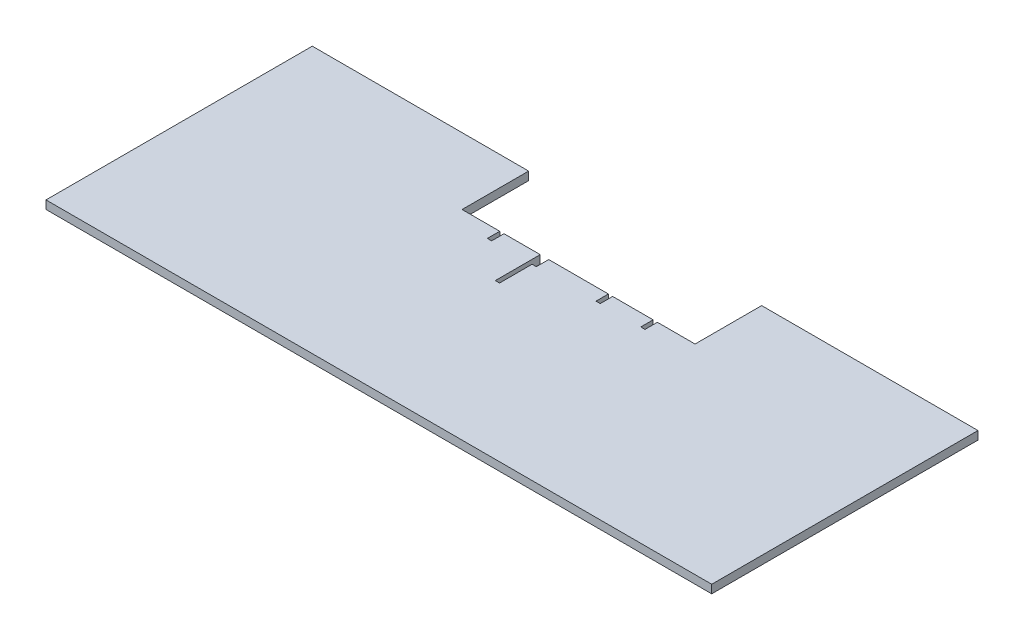
ISO-10303-21;
HEADER;
FILE_DESCRIPTION(('STEP AP214'),'2;1');
FILE_NAME('part.step','',(''),(''),'','','');
FILE_SCHEMA(('AUTOMOTIVE_DESIGN { 1 0 10303 214 1 1 1 1 }'));
ENDSEC;
DATA;
#1=APPLICATION_CONTEXT('core data for automotive mechanical design processes');
#2=APPLICATION_PROTOCOL_DEFINITION('international standard','automotive_design',2000,#1);
#3=PRODUCT_CONTEXT('',#1,'mechanical');
#4=PRODUCT('Part','Part','',(#3));
#5=PRODUCT_RELATED_PRODUCT_CATEGORY('part','',(#4));
#6=PRODUCT_DEFINITION_FORMATION('','',#4);
#7=PRODUCT_DEFINITION_CONTEXT('part definition',#1,'design');
#8=PRODUCT_DEFINITION('design','',#6,#7);
#9=PRODUCT_DEFINITION_SHAPE('','',#8);
#10=(LENGTH_UNIT() NAMED_UNIT(*) SI_UNIT(.MILLI.,.METRE.));
#11=(NAMED_UNIT(*) PLANE_ANGLE_UNIT() SI_UNIT($,.RADIAN.));
#12=(NAMED_UNIT(*) SI_UNIT($,.STERADIAN.) SOLID_ANGLE_UNIT());
#13=UNCERTAINTY_MEASURE_WITH_UNIT(LENGTH_MEASURE(1.E-05),#10,'distance_accuracy_value','');
#14=(GEOMETRIC_REPRESENTATION_CONTEXT(3) GLOBAL_UNCERTAINTY_ASSIGNED_CONTEXT((#13)) GLOBAL_UNIT_ASSIGNED_CONTEXT((#10,
#11,#12)) REPRESENTATION_CONTEXT('',''));
#15=CARTESIAN_POINT('',(0.,0.,0.));
#16=DIRECTION('',(0.,0.,1.));
#17=DIRECTION('',(1.,0.,0.));
#18=AXIS2_PLACEMENT_3D('',#15,#16,#17);
#19=CARTESIAN_POINT('',(82.55,3.175,-76.2));
#20=DIRECTION('',(0.,0.,1.));
#21=DIRECTION('',(1.,0.,0.));
#22=AXIS2_PLACEMENT_3D('',#19,#20,#21);
#23=PLANE('',#22);
#24=DIRECTION('',(-1.,0.,0.));
#25=VECTOR('',#24,1.);
#26=CARTESIAN_POINT('',(82.55,0.,-76.2));
#27=LINE('',#26,#25);
#28=CARTESIAN_POINT('',(171.45,0.,-76.2));
#29=VERTEX_POINT('',#28);
#30=CARTESIAN_POINT('',(157.070331057297,0.,-76.2));
#31=VERTEX_POINT('',#30);
#32=EDGE_CURVE('E221',#29,#31,#27,.T.);
#33=ORIENTED_EDGE('',*,*,#32,.T.);
#34=DIRECTION('',(0.,1.,0.));
#35=VECTOR('',#34,1.);
#36=CARTESIAN_POINT('',(157.070331057297,-0.00100000000000013,-76.2));
#37=LINE('',#36,#35);
#38=CARTESIAN_POINT('',(157.070331057297,3.175,-76.2));
#39=VERTEX_POINT('',#38);
#40=EDGE_CURVE('E202',#31,#39,#37,.T.);
#41=ORIENTED_EDGE('',*,*,#40,.T.);
#42=DIRECTION('',(-1.,0.,0.));
#43=VECTOR('',#42,1.);
#44=CARTESIAN_POINT('',(82.55,3.175,-76.2));
#45=LINE('',#44,#43);
#46=CARTESIAN_POINT('',(171.45,3.175,-76.2));
#47=VERTEX_POINT('',#46);
#48=EDGE_CURVE('E262',#47,#39,#45,.T.);
#49=ORIENTED_EDGE('',*,*,#48,.F.);
#50=DIRECTION('',(0.,-1.,0.));
#51=VECTOR('',#50,1.);
#52=CARTESIAN_POINT('',(171.45,3.175,-76.2));
#53=LINE('',#52,#51);
#54=EDGE_CURVE('E228',#47,#29,#53,.T.);
#55=ORIENTED_EDGE('',*,*,#54,.T.);
#56=EDGE_LOOP('',(#33,#41,#49,#55));
#57=FACE_BOUND('',#56,.T.);
#58=ADVANCED_FACE('F30',(#57),#23,.F.);
#59=CARTESIAN_POINT('',(155.444731057297,3.175,-76.2000000000002));
#60=VERTEX_POINT('',#59);
#61=CARTESIAN_POINT('',(140.003991611403,3.175,-76.2000000000001));
#62=VERTEX_POINT('',#61);
#63=EDGE_CURVE('E264',#60,#62,#45,.T.);
#64=ORIENTED_EDGE('',*,*,#63,.F.);
#65=DIRECTION('',(0.,1.,0.));
#66=VECTOR('',#65,1.);
#67=CARTESIAN_POINT('',(155.444731057297,-0.00100000000000013,-76.2000000000002));
#68=LINE('',#67,#66);
#69=CARTESIAN_POINT('',(155.444731057297,0.,-76.2));
#70=VERTEX_POINT('',#69);
#71=EDGE_CURVE('E372',#70,#60,#68,.T.);
#72=ORIENTED_EDGE('',*,*,#71,.F.);
#73=CARTESIAN_POINT('',(140.003991611403,0.,-76.2));
#74=VERTEX_POINT('',#73);
#75=EDGE_CURVE('E230',#70,#74,#27,.T.);
#76=ORIENTED_EDGE('',*,*,#75,.T.);
#77=DIRECTION('',(0.,1.,0.));
#78=VECTOR('',#77,1.);
#79=CARTESIAN_POINT('',(140.003991611403,-0.00100000000000013,-76.2000000000001));
#80=LINE('',#79,#78);
#81=EDGE_CURVE('E349',#74,#62,#80,.T.);
#82=ORIENTED_EDGE('',*,*,#81,.T.);
#83=EDGE_LOOP('',(#64,#72,#76,#82));
#84=FACE_BOUND('',#83,.T.);
#85=ADVANCED_FACE('F392',(#84),#23,.F.);
#86=CARTESIAN_POINT('',(138.378391611403,3.175,-76.2000000000001));
#87=VERTEX_POINT('',#86);
#88=CARTESIAN_POINT('',(115.621608388597,3.175,-76.2));
#89=VERTEX_POINT('',#88);
#90=EDGE_CURVE('E395',#87,#89,#45,.T.);
#91=ORIENTED_EDGE('',*,*,#90,.F.);
#92=DIRECTION('',(0.,1.,0.));
#93=VECTOR('',#92,1.);
#94=CARTESIAN_POINT('',(138.378391611403,-0.00100000000000013,-76.2000000000001));
#95=LINE('',#94,#93);
#96=CARTESIAN_POINT('',(138.378391611403,0.,-76.2));
#97=VERTEX_POINT('',#96);
#98=EDGE_CURVE('E350',#97,#87,#95,.T.);
#99=ORIENTED_EDGE('',*,*,#98,.F.);
#100=CARTESIAN_POINT('',(115.621608388597,0.,-76.2));
#101=VERTEX_POINT('',#100);
#102=EDGE_CURVE('E235',#97,#101,#27,.T.);
#103=ORIENTED_EDGE('',*,*,#102,.T.);
#104=DIRECTION('',(0.,1.,0.));
#105=VECTOR('',#104,1.);
#106=CARTESIAN_POINT('',(115.621608388597,-0.00100000000000013,-76.2));
#107=LINE('',#106,#105);
#108=EDGE_CURVE('E306',#101,#89,#107,.T.);
#109=ORIENTED_EDGE('',*,*,#108,.T.);
#110=EDGE_LOOP('',(#91,#99,#103,#109));
#111=FACE_BOUND('',#110,.T.);
#112=ADVANCED_FACE('F485',(#111),#23,.F.);
#113=CARTESIAN_POINT('',(96.9296689427032,3.175,-76.2));
#114=VERTEX_POINT('',#113);
#115=CARTESIAN_POINT('',(82.55,3.175,-76.2));
#116=VERTEX_POINT('',#115);
#117=EDGE_CURVE('E265',#114,#116,#45,.T.);
#118=ORIENTED_EDGE('',*,*,#117,.F.);
#119=DIRECTION('',(0.,1.,0.));
#120=VECTOR('',#119,1.);
#121=CARTESIAN_POINT('',(96.9296689427032,-0.00100000000000013,-76.2));
#122=LINE('',#121,#120);
#123=CARTESIAN_POINT('',(96.9296689427032,0.,-76.2));
#124=VERTEX_POINT('',#123);
#125=EDGE_CURVE('E279',#124,#114,#122,.T.);
#126=ORIENTED_EDGE('',*,*,#125,.F.);
#127=CARTESIAN_POINT('',(82.55,0.,-76.2));
#128=VERTEX_POINT('',#127);
#129=EDGE_CURVE('E232',#124,#128,#27,.T.);
#130=ORIENTED_EDGE('',*,*,#129,.T.);
#131=DIRECTION('',(0.,-1.,0.));
#132=VECTOR('',#131,1.);
#133=CARTESIAN_POINT('',(82.55,3.175,-76.2));
#134=LINE('',#133,#132);
#135=EDGE_CURVE('E408',#116,#128,#134,.T.);
#136=ORIENTED_EDGE('',*,*,#135,.F.);
#137=EDGE_LOOP('',(#118,#126,#130,#136));
#138=FACE_BOUND('',#137,.T.);
#139=ADVANCED_FACE('F409',(#138),#23,.F.);
#140=CARTESIAN_POINT('',(0.,3.175,0.));
#141=DIRECTION('',(1.,0.,0.));
#142=DIRECTION('',(0.,0.,-1.));
#143=AXIS2_PLACEMENT_3D('',#140,#141,#142);
#144=PLANE('',#143);
#145=DIRECTION('',(0.,0.,1.));
#146=VECTOR('',#145,1.);
#147=CARTESIAN_POINT('',(0.,0.,0.));
#148=LINE('',#147,#146);
#149=CARTESIAN_POINT('',(0.,0.,-101.6));
#150=VERTEX_POINT('',#149);
#151=CARTESIAN_POINT('',(0.,0.,0.));
#152=VERTEX_POINT('',#151);
#153=EDGE_CURVE('E253',#150,#152,#148,.T.);
#154=ORIENTED_EDGE('',*,*,#153,.T.);
#155=DIRECTION('',(0.,-1.,0.));
#156=VECTOR('',#155,1.);
#157=CARTESIAN_POINT('',(0.,3.175,0.));
#158=LINE('',#157,#156);
#159=CARTESIAN_POINT('',(0.,3.175,0.));
#160=VERTEX_POINT('',#159);
#161=EDGE_CURVE('E11',#160,#152,#158,.T.);
#162=ORIENTED_EDGE('',*,*,#161,.F.);
#163=DIRECTION('',(0.,0.,1.));
#164=VECTOR('',#163,1.);
#165=CARTESIAN_POINT('',(0.,3.175,0.));
#166=LINE('',#165,#164);
#167=CARTESIAN_POINT('',(0.,3.175,-101.6));
#168=VERTEX_POINT('',#167);
#169=EDGE_CURVE('E274',#168,#160,#166,.T.);
#170=ORIENTED_EDGE('',*,*,#169,.F.);
#171=DIRECTION('',(0.,-1.,0.));
#172=VECTOR('',#171,1.);
#173=CARTESIAN_POINT('',(0.,3.175,-101.6));
#174=LINE('',#173,#172);
#175=EDGE_CURVE('E259',#168,#150,#174,.T.);
#176=ORIENTED_EDGE('',*,*,#175,.T.);
#177=EDGE_LOOP('',(#154,#162,#170,#176));
#178=FACE_BOUND('',#177,.T.);
#179=ADVANCED_FACE('F32',(#178),#144,.F.);
#180=CARTESIAN_POINT('',(0.,3.175,0.));
#181=DIRECTION('',(0.,0.,-1.));
#182=DIRECTION('',(-1.,0.,0.));
#183=AXIS2_PLACEMENT_3D('',#180,#181,#182);
#184=PLANE('',#183);
#185=DIRECTION('',(1.,0.,0.));
#186=VECTOR('',#185,1.);
#187=CARTESIAN_POINT('',(0.,0.,0.));
#188=LINE('',#187,#186);
#189=CARTESIAN_POINT('',(254.,0.,0.));
#190=VERTEX_POINT('',#189);
#191=EDGE_CURVE('E251',#152,#190,#188,.T.);
#192=ORIENTED_EDGE('',*,*,#191,.T.);
#193=DIRECTION('',(0.,-1.,0.));
#194=VECTOR('',#193,1.);
#195=CARTESIAN_POINT('',(254.,3.175,0.));
#196=LINE('',#195,#194);
#197=CARTESIAN_POINT('',(254.,3.175,0.));
#198=VERTEX_POINT('',#197);
#199=EDGE_CURVE('E38',#198,#190,#196,.T.);
#200=ORIENTED_EDGE('',*,*,#199,.F.);
#201=DIRECTION('',(1.,0.,0.));
#202=VECTOR('',#201,1.);
#203=CARTESIAN_POINT('',(0.,3.175,0.));
#204=LINE('',#203,#202);
#205=EDGE_CURVE('E272',#160,#198,#204,.T.);
#206=ORIENTED_EDGE('',*,*,#205,.F.);
#207=ORIENTED_EDGE('',*,*,#161,.T.);
#208=EDGE_LOOP('',(#192,#200,#206,#207));
#209=FACE_BOUND('',#208,.T.);
#210=ADVANCED_FACE('F429',(#209),#184,.F.);
#211=CARTESIAN_POINT('',(254.,3.175,0.));
#212=DIRECTION('',(-1.,0.,0.));
#213=DIRECTION('',(0.,0.,1.));
#214=AXIS2_PLACEMENT_3D('',#211,#212,#213);
#215=PLANE('',#214);
#216=DIRECTION('',(0.,0.,-1.));
#217=VECTOR('',#216,1.);
#218=CARTESIAN_POINT('',(254.,0.,0.));
#219=LINE('',#218,#217);
#220=CARTESIAN_POINT('',(254.,0.,-101.6));
#221=VERTEX_POINT('',#220);
#222=EDGE_CURVE('E247',#190,#221,#219,.T.);
#223=ORIENTED_EDGE('',*,*,#222,.T.);
#224=DIRECTION('',(0.,-1.,0.));
#225=VECTOR('',#224,1.);
#226=CARTESIAN_POINT('',(254.,3.175,-101.6));
#227=LINE('',#226,#225);
#228=CARTESIAN_POINT('',(254.,3.175,-101.6));
#229=VERTEX_POINT('',#228);
#230=EDGE_CURVE('E434',#229,#221,#227,.T.);
#231=ORIENTED_EDGE('',*,*,#230,.F.);
#232=DIRECTION('',(0.,0.,-1.));
#233=VECTOR('',#232,1.);
#234=CARTESIAN_POINT('',(254.,3.175,0.));
#235=LINE('',#234,#233);
#236=EDGE_CURVE('E270',#198,#229,#235,.T.);
#237=ORIENTED_EDGE('',*,*,#236,.F.);
#238=ORIENTED_EDGE('',*,*,#199,.T.);
#239=EDGE_LOOP('',(#223,#231,#237,#238));
#240=FACE_BOUND('',#239,.T.);
#241=ADVANCED_FACE('F436',(#240),#215,.F.);
#242=CARTESIAN_POINT('',(171.45,3.175,-101.6));
#243=DIRECTION('',(0.,0.,1.));
#244=DIRECTION('',(1.,0.,0.));
#245=AXIS2_PLACEMENT_3D('',#242,#243,#244);
#246=PLANE('',#245);
#247=DIRECTION('',(-1.,0.,0.));
#248=VECTOR('',#247,1.);
#249=CARTESIAN_POINT('',(171.45,0.,-101.6));
#250=LINE('',#249,#248);
#251=CARTESIAN_POINT('',(171.45,0.,-101.6));
#252=VERTEX_POINT('',#251);
#253=EDGE_CURVE('E244',#221,#252,#250,.T.);
#254=ORIENTED_EDGE('',*,*,#253,.T.);
#255=DIRECTION('',(0.,-1.,0.));
#256=VECTOR('',#255,1.);
#257=CARTESIAN_POINT('',(171.45,3.175,-101.6));
#258=LINE('',#257,#256);
#259=CARTESIAN_POINT('',(171.45,3.175,-101.6));
#260=VERTEX_POINT('',#259);
#261=EDGE_CURVE('E442',#260,#252,#258,.T.);
#262=ORIENTED_EDGE('',*,*,#261,.F.);
#263=DIRECTION('',(-1.,0.,0.));
#264=VECTOR('',#263,1.);
#265=CARTESIAN_POINT('',(171.45,3.175,-101.6));
#266=LINE('',#265,#264);
#267=EDGE_CURVE('E268',#229,#260,#266,.T.);
#268=ORIENTED_EDGE('',*,*,#267,.F.);
#269=ORIENTED_EDGE('',*,*,#230,.T.);
#270=EDGE_LOOP('',(#254,#262,#268,#269));
#271=FACE_BOUND('',#270,.T.);
#272=ADVANCED_FACE('F443',(#271),#246,.F.);
#273=CARTESIAN_POINT('',(171.45,3.175,-101.6));
#274=DIRECTION('',(1.,0.,0.));
#275=DIRECTION('',(0.,0.,-1.));
#276=AXIS2_PLACEMENT_3D('',#273,#274,#275);
#277=PLANE('',#276);
#278=DIRECTION('',(0.,0.,1.));
#279=VECTOR('',#278,1.);
#280=CARTESIAN_POINT('',(171.45,0.,-101.6));
#281=LINE('',#280,#279);
#282=EDGE_CURVE('E238',#252,#29,#281,.T.);
#283=ORIENTED_EDGE('',*,*,#282,.T.);
#284=ORIENTED_EDGE('',*,*,#54,.F.);
#285=DIRECTION('',(0.,0.,1.));
#286=VECTOR('',#285,1.);
#287=CARTESIAN_POINT('',(171.45,3.175,-101.6));
#288=LINE('',#287,#286);
#289=EDGE_CURVE('E266',#260,#47,#288,.T.);
#290=ORIENTED_EDGE('',*,*,#289,.F.);
#291=ORIENTED_EDGE('',*,*,#261,.T.);
#292=EDGE_LOOP('',(#283,#284,#290,#291));
#293=FACE_BOUND('',#292,.T.);
#294=ADVANCED_FACE('F446',(#293),#277,.F.);
#295=CARTESIAN_POINT('',(112.370408388597,3.175,-76.2));
#296=VERTEX_POINT('',#295);
#297=CARTESIAN_POINT('',(98.5552689427032,3.175,-76.2000000000002));
#298=VERTEX_POINT('',#297);
#299=EDGE_CURVE('E396',#296,#298,#45,.T.);
#300=ORIENTED_EDGE('',*,*,#299,.F.);
#301=DIRECTION('',(0.,1.,0.));
#302=VECTOR('',#301,1.);
#303=CARTESIAN_POINT('',(112.370408388597,-0.00100000000000013,-76.2));
#304=LINE('',#303,#302);
#305=CARTESIAN_POINT('',(112.370408388597,0.,-76.2));
#306=VERTEX_POINT('',#305);
#307=EDGE_CURVE('E307',#306,#296,#304,.T.);
#308=ORIENTED_EDGE('',*,*,#307,.F.);
#309=CARTESIAN_POINT('',(98.5552689427032,0.,-76.2));
#310=VERTEX_POINT('',#309);
#311=EDGE_CURVE('E237',#306,#310,#27,.T.);
#312=ORIENTED_EDGE('',*,*,#311,.T.);
#313=DIRECTION('',(0.,1.,0.));
#314=VECTOR('',#313,1.);
#315=CARTESIAN_POINT('',(98.5552689427032,-0.00100000000000013,-76.2000000000002));
#316=LINE('',#315,#314);
#317=EDGE_CURVE('E285',#310,#298,#316,.T.);
#318=ORIENTED_EDGE('',*,*,#317,.T.);
#319=EDGE_LOOP('',(#300,#308,#312,#318));
#320=FACE_BOUND('',#319,.T.);
#321=ADVANCED_FACE('F463',(#320),#23,.F.);
#322=CARTESIAN_POINT('',(82.55,3.175,-101.6));
#323=DIRECTION('',(-1.,0.,0.));
#324=DIRECTION('',(0.,0.,1.));
#325=AXIS2_PLACEMENT_3D('',#322,#323,#324);
#326=PLANE('',#325);
#327=DIRECTION('',(0.,0.,-1.));
#328=VECTOR('',#327,1.);
#329=CARTESIAN_POINT('',(82.55,0.,-101.6));
#330=LINE('',#329,#328);
#331=CARTESIAN_POINT('',(82.55,0.,-101.6));
#332=VERTEX_POINT('',#331);
#333=EDGE_CURVE('E229',#128,#332,#330,.T.);
#334=ORIENTED_EDGE('',*,*,#333,.T.);
#335=DIRECTION('',(0.,-1.,0.));
#336=VECTOR('',#335,1.);
#337=CARTESIAN_POINT('',(82.55,3.175,-101.6));
#338=LINE('',#337,#336);
#339=CARTESIAN_POINT('',(82.55,3.175,-101.6));
#340=VERTEX_POINT('',#339);
#341=EDGE_CURVE('E412',#340,#332,#338,.T.);
#342=ORIENTED_EDGE('',*,*,#341,.F.);
#343=DIRECTION('',(0.,0.,-1.));
#344=VECTOR('',#343,1.);
#345=CARTESIAN_POINT('',(82.55,3.175,-101.6));
#346=LINE('',#345,#344);
#347=EDGE_CURVE('E260',#116,#340,#346,.T.);
#348=ORIENTED_EDGE('',*,*,#347,.F.);
#349=ORIENTED_EDGE('',*,*,#135,.T.);
#350=EDGE_LOOP('',(#334,#342,#348,#349));
#351=FACE_BOUND('',#350,.T.);
#352=ADVANCED_FACE('F414',(#351),#326,.F.);
#353=CARTESIAN_POINT('',(0.,3.175,-101.6));
#354=DIRECTION('',(0.,0.,1.));
#355=DIRECTION('',(1.,0.,0.));
#356=AXIS2_PLACEMENT_3D('',#353,#354,#355);
#357=PLANE('',#356);
#358=DIRECTION('',(-1.,0.,0.));
#359=VECTOR('',#358,1.);
#360=CARTESIAN_POINT('',(0.,0.,-101.6));
#361=LINE('',#360,#359);
#362=EDGE_CURVE('E233',#332,#150,#361,.T.);
#363=ORIENTED_EDGE('',*,*,#362,.T.);
#364=ORIENTED_EDGE('',*,*,#175,.F.);
#365=DIRECTION('',(-1.,0.,0.));
#366=VECTOR('',#365,1.);
#367=CARTESIAN_POINT('',(0.,3.175,-101.6));
#368=LINE('',#367,#366);
#369=EDGE_CURVE('E257',#340,#168,#368,.T.);
#370=ORIENTED_EDGE('',*,*,#369,.F.);
#371=ORIENTED_EDGE('',*,*,#341,.T.);
#372=EDGE_LOOP('',(#363,#364,#370,#371));
#373=FACE_BOUND('',#372,.T.);
#374=ADVANCED_FACE('F421',(#373),#357,.F.);
#375=CARTESIAN_POINT('',(0.,3.175,-101.6));
#376=DIRECTION('',(0.,-1.,0.));
#377=DIRECTION('',(0.,0.,-1.));
#378=AXIS2_PLACEMENT_3D('',#375,#376,#377);
#379=PLANE('',#378);
#380=ORIENTED_EDGE('',*,*,#48,.T.);
#381=DIRECTION('',(0.,0.,-1.));
#382=VECTOR('',#381,1.);
#383=CARTESIAN_POINT('',(157.070331057297,3.175,-76.2));
#384=LINE('',#383,#382);
#385=CARTESIAN_POINT('',(157.070331057297,3.175,-71.4756));
#386=VERTEX_POINT('',#385);
#387=EDGE_CURVE('E208',#386,#39,#384,.T.);
#388=ORIENTED_EDGE('',*,*,#387,.F.);
#389=DIRECTION('',(1.,0.,0.));
#390=VECTOR('',#389,1.);
#391=CARTESIAN_POINT('',(157.070331057297,3.175,-71.4756));
#392=LINE('',#391,#390);
#393=CARTESIAN_POINT('',(155.444731057297,3.175,-71.4756));
#394=VERTEX_POINT('',#393);
#395=EDGE_CURVE('E377',#394,#386,#392,.T.);
#396=ORIENTED_EDGE('',*,*,#395,.F.);
#397=DIRECTION('',(0.,0.,1.));
#398=VECTOR('',#397,1.);
#399=CARTESIAN_POINT('',(155.444731057297,3.175,-76.2000000000002));
#400=LINE('',#399,#398);
#401=EDGE_CURVE('E224',#60,#394,#400,.T.);
#402=ORIENTED_EDGE('',*,*,#401,.F.);
#403=ORIENTED_EDGE('',*,*,#63,.T.);
#404=DIRECTION('',(0.,0.,-1.));
#405=VECTOR('',#404,1.);
#406=CARTESIAN_POINT('',(140.003991611403,3.175,-76.2000000000001));
#407=LINE('',#406,#405);
#408=CARTESIAN_POINT('',(140.003991611403,3.175,-71.4756000000001));
#409=VERTEX_POINT('',#408);
#410=EDGE_CURVE('E352',#409,#62,#407,.T.);
#411=ORIENTED_EDGE('',*,*,#410,.F.);
#412=DIRECTION('',(1.,0.,0.));
#413=VECTOR('',#412,1.);
#414=CARTESIAN_POINT('',(140.003991611403,3.175,-71.4756000000001));
#415=LINE('',#414,#413);
#416=CARTESIAN_POINT('',(138.378391611403,3.175,-71.4756000000001));
#417=VERTEX_POINT('',#416);
#418=EDGE_CURVE('E360',#417,#409,#415,.T.);
#419=ORIENTED_EDGE('',*,*,#418,.F.);
#420=DIRECTION('',(0.,0.,1.));
#421=VECTOR('',#420,1.);
#422=CARTESIAN_POINT('',(138.378391611403,3.175,-76.2000000000001));
#423=LINE('',#422,#421);
#424=EDGE_CURVE('E363',#87,#417,#423,.T.);
#425=ORIENTED_EDGE('',*,*,#424,.F.);
#426=ORIENTED_EDGE('',*,*,#90,.T.);
#427=DIRECTION('',(0.,0.,-1.));
#428=VECTOR('',#427,1.);
#429=CARTESIAN_POINT('',(115.621608388597,3.175,-76.2));
#430=LINE('',#429,#428);
#431=CARTESIAN_POINT('',(115.621608388597,3.175,-71.4756));
#432=VERTEX_POINT('',#431);
#433=EDGE_CURVE('E310',#432,#89,#430,.T.);
#434=ORIENTED_EDGE('',*,*,#433,.F.);
#435=DIRECTION('',(1.,0.,0.));
#436=VECTOR('',#435,1.);
#437=CARTESIAN_POINT('',(113.996008388597,3.175,-71.4756));
#438=LINE('',#437,#436);
#439=CARTESIAN_POINT('',(113.996008388597,3.175,-71.4756));
#440=VERTEX_POINT('',#439);
#441=EDGE_CURVE('E322',#440,#432,#438,.T.);
#442=ORIENTED_EDGE('',*,*,#441,.F.);
#443=DIRECTION('',(0.,0.,-1.));
#444=VECTOR('',#443,1.);
#445=CARTESIAN_POINT('',(113.996008388597,3.175,-71.4756));
#446=LINE('',#445,#444);
#447=CARTESIAN_POINT('',(113.996008388597,3.175,-59.055));
#448=VERTEX_POINT('',#447);
#449=EDGE_CURVE('E325',#448,#440,#446,.T.);
#450=ORIENTED_EDGE('',*,*,#449,.F.);
#451=DIRECTION('',(1.,0.,0.));
#452=VECTOR('',#451,1.);
#453=CARTESIAN_POINT('',(113.996008388597,3.175,-59.055));
#454=LINE('',#453,#452);
#455=CARTESIAN_POINT('',(112.370408388597,3.175,-59.055));
#456=VERTEX_POINT('',#455);
#457=EDGE_CURVE('E328',#456,#448,#454,.T.);
#458=ORIENTED_EDGE('',*,*,#457,.F.);
#459=DIRECTION('',(0.,0.,1.));
#460=VECTOR('',#459,1.);
#461=CARTESIAN_POINT('',(112.370408388597,3.175,-76.2));
#462=LINE('',#461,#460);
#463=EDGE_CURVE('E331',#296,#456,#462,.T.);
#464=ORIENTED_EDGE('',*,*,#463,.F.);
#465=ORIENTED_EDGE('',*,*,#299,.T.);
#466=DIRECTION('',(0.,0.,-1.));
#467=VECTOR('',#466,1.);
#468=CARTESIAN_POINT('',(98.5552689427032,3.175,-76.2000000000002));
#469=LINE('',#468,#467);
#470=CARTESIAN_POINT('',(98.5552689427032,3.175,-71.4756));
#471=VERTEX_POINT('',#470);
#472=EDGE_CURVE('E283',#471,#298,#469,.T.);
#473=ORIENTED_EDGE('',*,*,#472,.F.);
#474=DIRECTION('',(1.,0.,0.));
#475=VECTOR('',#474,1.);
#476=CARTESIAN_POINT('',(96.9296689427032,3.175,-71.4756));
#477=LINE('',#476,#475);
#478=CARTESIAN_POINT('',(96.9296689427032,3.175,-71.4756));
#479=VERTEX_POINT('',#478);
#480=EDGE_CURVE('E291',#479,#471,#477,.T.);
#481=ORIENTED_EDGE('',*,*,#480,.F.);
#482=DIRECTION('',(0.,0.,1.));
#483=VECTOR('',#482,1.);
#484=CARTESIAN_POINT('',(96.9296689427032,3.175,-76.2));
#485=LINE('',#484,#483);
#486=EDGE_CURVE('E294',#114,#479,#485,.T.);
#487=ORIENTED_EDGE('',*,*,#486,.F.);
#488=ORIENTED_EDGE('',*,*,#117,.T.);
#489=ORIENTED_EDGE('',*,*,#347,.T.);
#490=ORIENTED_EDGE('',*,*,#369,.T.);
#491=ORIENTED_EDGE('',*,*,#169,.T.);
#492=ORIENTED_EDGE('',*,*,#205,.T.);
#493=ORIENTED_EDGE('',*,*,#236,.T.);
#494=ORIENTED_EDGE('',*,*,#267,.T.);
#495=ORIENTED_EDGE('',*,*,#289,.T.);
#496=EDGE_LOOP('',(#380,#388,#396,#402,#403,#411,#419,#425,#426,#434,#442,#450,#458,#464,#465,
#473,#481,#487,#488,#489,#490,#491,#492,#493,#494,#495));
#497=FACE_BOUND('',#496,.T.);
#498=ADVANCED_FACE('F387',(#497),#379,.F.);
#499=CARTESIAN_POINT('',(0.,0.,-101.6));
#500=DIRECTION('',(0.,-1.,0.));
#501=DIRECTION('',(0.,0.,-1.));
#502=AXIS2_PLACEMENT_3D('',#499,#500,#501);
#503=PLANE('',#502);
#504=DIRECTION('',(0.,0.,-1.));
#505=VECTOR('',#504,1.);
#506=CARTESIAN_POINT('',(157.070331057297,0.,-76.2));
#507=LINE('',#506,#505);
#508=CARTESIAN_POINT('',(157.070331057297,0.,-71.4756));
#509=VERTEX_POINT('',#508);
#510=EDGE_CURVE('E205',#509,#31,#507,.T.);
#511=ORIENTED_EDGE('',*,*,#510,.T.);
#512=ORIENTED_EDGE('',*,*,#32,.F.);
#513=ORIENTED_EDGE('',*,*,#282,.F.);
#514=ORIENTED_EDGE('',*,*,#253,.F.);
#515=ORIENTED_EDGE('',*,*,#222,.F.);
#516=ORIENTED_EDGE('',*,*,#191,.F.);
#517=ORIENTED_EDGE('',*,*,#153,.F.);
#518=ORIENTED_EDGE('',*,*,#362,.F.);
#519=ORIENTED_EDGE('',*,*,#333,.F.);
#520=ORIENTED_EDGE('',*,*,#129,.F.);
#521=DIRECTION('',(0.,0.,1.));
#522=VECTOR('',#521,1.);
#523=CARTESIAN_POINT('',(96.9296689427032,0.,-76.2));
#524=LINE('',#523,#522);
#525=CARTESIAN_POINT('',(96.9296689427032,0.,-71.4756));
#526=VERTEX_POINT('',#525);
#527=EDGE_CURVE('E297',#124,#526,#524,.T.);
#528=ORIENTED_EDGE('',*,*,#527,.T.);
#529=DIRECTION('',(1.,0.,0.));
#530=VECTOR('',#529,1.);
#531=CARTESIAN_POINT('',(96.9296689427032,0.,-71.4756));
#532=LINE('',#531,#530);
#533=CARTESIAN_POINT('',(98.5552689427032,0.,-71.4756));
#534=VERTEX_POINT('',#533);
#535=EDGE_CURVE('E256',#526,#534,#532,.T.);
#536=ORIENTED_EDGE('',*,*,#535,.T.);
#537=DIRECTION('',(0.,0.,-1.));
#538=VECTOR('',#537,1.);
#539=CARTESIAN_POINT('',(98.5552689427032,0.,-76.2000000000002));
#540=LINE('',#539,#538);
#541=EDGE_CURVE('E300',#534,#310,#540,.T.);
#542=ORIENTED_EDGE('',*,*,#541,.T.);
#543=ORIENTED_EDGE('',*,*,#311,.F.);
#544=DIRECTION('',(0.,0.,1.));
#545=VECTOR('',#544,1.);
#546=CARTESIAN_POINT('',(112.370408388597,0.,-76.2));
#547=LINE('',#546,#545);
#548=CARTESIAN_POINT('',(112.370408388597,0.,-59.055));
#549=VERTEX_POINT('',#548);
#550=EDGE_CURVE('E303',#306,#549,#547,.T.);
#551=ORIENTED_EDGE('',*,*,#550,.T.);
#552=DIRECTION('',(1.,0.,0.));
#553=VECTOR('',#552,1.);
#554=CARTESIAN_POINT('',(113.996008388597,0.,-59.055));
#555=LINE('',#554,#553);
#556=CARTESIAN_POINT('',(113.996008388597,0.,-59.055));
#557=VERTEX_POINT('',#556);
#558=EDGE_CURVE('E343',#549,#557,#555,.T.);
#559=ORIENTED_EDGE('',*,*,#558,.T.);
#560=DIRECTION('',(0.,0.,-1.));
#561=VECTOR('',#560,1.);
#562=CARTESIAN_POINT('',(113.996008388597,0.,-71.4756));
#563=LINE('',#562,#561);
#564=CARTESIAN_POINT('',(113.996008388597,0.,-71.4756));
#565=VERTEX_POINT('',#564);
#566=EDGE_CURVE('E340',#557,#565,#563,.T.);
#567=ORIENTED_EDGE('',*,*,#566,.T.);
#568=DIRECTION('',(1.,0.,0.));
#569=VECTOR('',#568,1.);
#570=CARTESIAN_POINT('',(113.996008388597,0.,-71.4756));
#571=LINE('',#570,#569);
#572=CARTESIAN_POINT('',(115.621608388597,0.,-71.4756));
#573=VERTEX_POINT('',#572);
#574=EDGE_CURVE('E337',#565,#573,#571,.T.);
#575=ORIENTED_EDGE('',*,*,#574,.T.);
#576=DIRECTION('',(0.,0.,-1.));
#577=VECTOR('',#576,1.);
#578=CARTESIAN_POINT('',(115.621608388597,0.,-76.2));
#579=LINE('',#578,#577);
#580=EDGE_CURVE('E334',#573,#101,#579,.T.);
#581=ORIENTED_EDGE('',*,*,#580,.T.);
#582=ORIENTED_EDGE('',*,*,#102,.F.);
#583=DIRECTION('',(0.,0.,1.));
#584=VECTOR('',#583,1.);
#585=CARTESIAN_POINT('',(138.378391611403,0.,-76.2000000000001));
#586=LINE('',#585,#584);
#587=CARTESIAN_POINT('',(138.378391611403,0.,-71.4756000000001));
#588=VERTEX_POINT('',#587);
#589=EDGE_CURVE('E346',#97,#588,#586,.T.);
#590=ORIENTED_EDGE('',*,*,#589,.T.);
#591=DIRECTION('',(1.,0.,0.));
#592=VECTOR('',#591,1.);
#593=CARTESIAN_POINT('',(140.003991611403,0.,-71.4756000000001));
#594=LINE('',#593,#592);
#595=CARTESIAN_POINT('',(140.003991611403,0.,-71.4756000000001));
#596=VERTEX_POINT('',#595);
#597=EDGE_CURVE('E368',#588,#596,#594,.T.);
#598=ORIENTED_EDGE('',*,*,#597,.T.);
#599=DIRECTION('',(0.,0.,-1.));
#600=VECTOR('',#599,1.);
#601=CARTESIAN_POINT('',(140.003991611403,0.,-76.2000000000001));
#602=LINE('',#601,#600);
#603=EDGE_CURVE('E365',#596,#74,#602,.T.);
#604=ORIENTED_EDGE('',*,*,#603,.T.);
#605=ORIENTED_EDGE('',*,*,#75,.F.);
#606=DIRECTION('',(0.,0.,1.));
#607=VECTOR('',#606,1.);
#608=CARTESIAN_POINT('',(155.444731057297,0.,-76.2000000000002));
#609=LINE('',#608,#607);
#610=CARTESIAN_POINT('',(155.444731057297,0.,-71.4756));
#611=VERTEX_POINT('',#610);
#612=EDGE_CURVE('E213',#70,#611,#609,.T.);
#613=ORIENTED_EDGE('',*,*,#612,.T.);
#614=DIRECTION('',(1.,0.,0.));
#615=VECTOR('',#614,1.);
#616=CARTESIAN_POINT('',(157.070331057297,0.,-71.4756));
#617=LINE('',#616,#615);
#618=EDGE_CURVE('E223',#611,#509,#617,.T.);
#619=ORIENTED_EDGE('',*,*,#618,.T.);
#620=EDGE_LOOP('',(#511,#512,#513,#514,#515,#516,#517,#518,#519,#520,#528,#536,#542,#543,#551,
#559,#567,#575,#581,#582,#590,#598,#604,#605,#613,#619));
#621=FACE_BOUND('',#620,.T.);
#622=ADVANCED_FACE('F219',(#621),#503,.T.);
#623=CARTESIAN_POINT('',(96.9296689427032,-0.00100000000000013,-76.2));
#624=DIRECTION('',(-1.,0.,0.));
#625=DIRECTION('',(0.,0.,1.));
#626=AXIS2_PLACEMENT_3D('',#623,#624,#625);
#627=PLANE('',#626);
#628=ORIENTED_EDGE('',*,*,#125,.T.);
#629=ORIENTED_EDGE('',*,*,#486,.T.);
#630=DIRECTION('',(0.,1.,0.));
#631=VECTOR('',#630,1.);
#632=CARTESIAN_POINT('',(96.9296689427032,-0.00100000000000013,-71.4756));
#633=LINE('',#632,#631);
#634=EDGE_CURVE('E280',#526,#479,#633,.T.);
#635=ORIENTED_EDGE('',*,*,#634,.F.);
#636=ORIENTED_EDGE('',*,*,#527,.F.);
#637=EDGE_LOOP('',(#628,#629,#635,#636));
#638=FACE_BOUND('',#637,.T.);
#639=ADVANCED_FACE('F453',(#638),#627,.F.);
#640=CARTESIAN_POINT('',(98.5552689427032,-0.00100000000000013,-76.2000000000002));
#641=DIRECTION('',(1.,0.,0.));
#642=DIRECTION('',(0.,0.,-1.));
#643=AXIS2_PLACEMENT_3D('',#640,#641,#642);
#644=PLANE('',#643);
#645=DIRECTION('',(0.,1.,0.));
#646=VECTOR('',#645,1.);
#647=CARTESIAN_POINT('',(98.5552689427032,-0.00100000000000013,-71.4756));
#648=LINE('',#647,#646);
#649=EDGE_CURVE('E282',#534,#471,#648,.T.);
#650=ORIENTED_EDGE('',*,*,#649,.T.);
#651=ORIENTED_EDGE('',*,*,#472,.T.);
#652=ORIENTED_EDGE('',*,*,#317,.F.);
#653=ORIENTED_EDGE('',*,*,#541,.F.);
#654=EDGE_LOOP('',(#650,#651,#652,#653));
#655=FACE_BOUND('',#654,.T.);
#656=ADVANCED_FACE('F459',(#655),#644,.F.);
#657=CARTESIAN_POINT('',(96.9296689427032,-0.00100000000000013,-71.4756));
#658=DIRECTION('',(0.,0.,1.));
#659=DIRECTION('',(1.,0.,0.));
#660=AXIS2_PLACEMENT_3D('',#657,#658,#659);
#661=PLANE('',#660);
#662=ORIENTED_EDGE('',*,*,#634,.T.);
#663=ORIENTED_EDGE('',*,*,#480,.T.);
#664=ORIENTED_EDGE('',*,*,#649,.F.);
#665=ORIENTED_EDGE('',*,*,#535,.F.);
#666=EDGE_LOOP('',(#662,#663,#664,#665));
#667=FACE_BOUND('',#666,.T.);
#668=ADVANCED_FACE('F455',(#667),#661,.F.);
#669=CARTESIAN_POINT('',(115.621608388597,-0.00100000000000013,-76.2));
#670=DIRECTION('',(1.,0.,0.));
#671=DIRECTION('',(0.,0.,-1.));
#672=AXIS2_PLACEMENT_3D('',#669,#670,#671);
#673=PLANE('',#672);
#674=DIRECTION('',(0.,1.,0.));
#675=VECTOR('',#674,1.);
#676=CARTESIAN_POINT('',(115.621608388597,-0.00100000000000013,-71.4756));
#677=LINE('',#676,#675);
#678=EDGE_CURVE('E316',#573,#432,#677,.T.);
#679=ORIENTED_EDGE('',*,*,#678,.T.);
#680=ORIENTED_EDGE('',*,*,#433,.T.);
#681=ORIENTED_EDGE('',*,*,#108,.F.);
#682=ORIENTED_EDGE('',*,*,#580,.F.);
#683=EDGE_LOOP('',(#679,#680,#681,#682));
#684=FACE_BOUND('',#683,.T.);
#685=ADVANCED_FACE('F480',(#684),#673,.F.);
#686=CARTESIAN_POINT('',(113.996008388597,-0.00100000000000013,-71.4756));
#687=DIRECTION('',(0.,0.,1.));
#688=DIRECTION('',(1.,0.,0.));
#689=AXIS2_PLACEMENT_3D('',#686,#687,#688);
#690=PLANE('',#689);
#691=DIRECTION('',(0.,1.,0.));
#692=VECTOR('',#691,1.);
#693=CARTESIAN_POINT('',(113.996008388597,-0.00100000000000013,-71.4756));
#694=LINE('',#693,#692);
#695=EDGE_CURVE('E314',#565,#440,#694,.T.);
#696=ORIENTED_EDGE('',*,*,#695,.T.);
#697=ORIENTED_EDGE('',*,*,#441,.T.);
#698=ORIENTED_EDGE('',*,*,#678,.F.);
#699=ORIENTED_EDGE('',*,*,#574,.F.);
#700=EDGE_LOOP('',(#696,#697,#698,#699));
#701=FACE_BOUND('',#700,.T.);
#702=ADVANCED_FACE('F477',(#701),#690,.F.);
#703=CARTESIAN_POINT('',(113.996008388597,-0.00100000000000013,-71.4756));
#704=DIRECTION('',(1.,0.,0.));
#705=DIRECTION('',(0.,0.,-1.));
#706=AXIS2_PLACEMENT_3D('',#703,#704,#705);
#707=PLANE('',#706);
#708=DIRECTION('',(0.,1.,0.));
#709=VECTOR('',#708,1.);
#710=CARTESIAN_POINT('',(113.996008388597,-0.00100000000000013,-59.055));
#711=LINE('',#710,#709);
#712=EDGE_CURVE('E312',#557,#448,#711,.T.);
#713=ORIENTED_EDGE('',*,*,#712,.T.);
#714=ORIENTED_EDGE('',*,*,#449,.T.);
#715=ORIENTED_EDGE('',*,*,#695,.F.);
#716=ORIENTED_EDGE('',*,*,#566,.F.);
#717=EDGE_LOOP('',(#713,#714,#715,#716));
#718=FACE_BOUND('',#717,.T.);
#719=ADVANCED_FACE('F475',(#718),#707,.F.);
#720=CARTESIAN_POINT('',(113.996008388597,-0.00100000000000013,-59.055));
#721=DIRECTION('',(0.,0.,1.));
#722=DIRECTION('',(1.,0.,0.));
#723=AXIS2_PLACEMENT_3D('',#720,#721,#722);
#724=PLANE('',#723);
#725=DIRECTION('',(0.,1.,0.));
#726=VECTOR('',#725,1.);
#727=CARTESIAN_POINT('',(112.370408388597,-0.00100000000000013,-59.055));
#728=LINE('',#727,#726);
#729=EDGE_CURVE('E309',#549,#456,#728,.T.);
#730=ORIENTED_EDGE('',*,*,#729,.T.);
#731=ORIENTED_EDGE('',*,*,#457,.T.);
#732=ORIENTED_EDGE('',*,*,#712,.F.);
#733=ORIENTED_EDGE('',*,*,#558,.F.);
#734=EDGE_LOOP('',(#730,#731,#732,#733));
#735=FACE_BOUND('',#734,.T.);
#736=ADVANCED_FACE('F471',(#735),#724,.F.);
#737=CARTESIAN_POINT('',(112.370408388597,-0.00100000000000013,-76.2));
#738=DIRECTION('',(-1.,0.,0.));
#739=DIRECTION('',(0.,0.,1.));
#740=AXIS2_PLACEMENT_3D('',#737,#738,#739);
#741=PLANE('',#740);
#742=ORIENTED_EDGE('',*,*,#307,.T.);
#743=ORIENTED_EDGE('',*,*,#463,.T.);
#744=ORIENTED_EDGE('',*,*,#729,.F.);
#745=ORIENTED_EDGE('',*,*,#550,.F.);
#746=EDGE_LOOP('',(#742,#743,#744,#745));
#747=FACE_BOUND('',#746,.T.);
#748=ADVANCED_FACE('F465',(#747),#741,.F.);
#749=CARTESIAN_POINT('',(140.003991611403,-0.00100000000000013,-76.2000000000001));
#750=DIRECTION('',(1.,0.,0.));
#751=DIRECTION('',(0.,0.,-1.));
#752=AXIS2_PLACEMENT_3D('',#749,#750,#751);
#753=PLANE('',#752);
#754=DIRECTION('',(0.,1.,0.));
#755=VECTOR('',#754,1.);
#756=CARTESIAN_POINT('',(140.003991611403,-0.00100000000000013,-71.4756000000001));
#757=LINE('',#756,#755);
#758=EDGE_CURVE('E354',#596,#409,#757,.T.);
#759=ORIENTED_EDGE('',*,*,#758,.T.);
#760=ORIENTED_EDGE('',*,*,#410,.T.);
#761=ORIENTED_EDGE('',*,*,#81,.F.);
#762=ORIENTED_EDGE('',*,*,#603,.F.);
#763=EDGE_LOOP('',(#759,#760,#761,#762));
#764=FACE_BOUND('',#763,.T.);
#765=ADVANCED_FACE('F492',(#764),#753,.F.);
#766=CARTESIAN_POINT('',(140.003991611403,-0.00100000000000013,-71.4756000000001));
#767=DIRECTION('',(0.,0.,1.));
#768=DIRECTION('',(1.,0.,0.));
#769=AXIS2_PLACEMENT_3D('',#766,#767,#768);
#770=PLANE('',#769);
#771=DIRECTION('',(0.,1.,0.));
#772=VECTOR('',#771,1.);
#773=CARTESIAN_POINT('',(138.378391611403,-0.00100000000000013,-71.4756000000001));
#774=LINE('',#773,#772);
#775=EDGE_CURVE('E53',#588,#417,#774,.T.);
#776=ORIENTED_EDGE('',*,*,#775,.T.);
#777=ORIENTED_EDGE('',*,*,#418,.T.);
#778=ORIENTED_EDGE('',*,*,#758,.F.);
#779=ORIENTED_EDGE('',*,*,#597,.F.);
#780=EDGE_LOOP('',(#776,#777,#778,#779));
#781=FACE_BOUND('',#780,.T.);
#782=ADVANCED_FACE('F490',(#781),#770,.F.);
#783=CARTESIAN_POINT('',(138.378391611403,-0.00100000000000013,-76.2000000000001));
#784=DIRECTION('',(-1.,0.,0.));
#785=DIRECTION('',(0.,0.,1.));
#786=AXIS2_PLACEMENT_3D('',#783,#784,#785);
#787=PLANE('',#786);
#788=ORIENTED_EDGE('',*,*,#98,.T.);
#789=ORIENTED_EDGE('',*,*,#424,.T.);
#790=ORIENTED_EDGE('',*,*,#775,.F.);
#791=ORIENTED_EDGE('',*,*,#589,.F.);
#792=EDGE_LOOP('',(#788,#789,#790,#791));
#793=FACE_BOUND('',#792,.T.);
#794=ADVANCED_FACE('F486',(#793),#787,.F.);
#795=CARTESIAN_POINT('',(157.070331057297,-0.00100000000000013,-76.2));
#796=DIRECTION('',(1.,0.,0.));
#797=DIRECTION('',(0.,0.,-1.));
#798=AXIS2_PLACEMENT_3D('',#795,#796,#797);
#799=PLANE('',#798);
#800=DIRECTION('',(0.,1.,0.));
#801=VECTOR('',#800,1.);
#802=CARTESIAN_POINT('',(157.070331057297,-0.00100000000000013,-71.4756));
#803=LINE('',#802,#801);
#804=EDGE_CURVE('E214',#509,#386,#803,.T.);
#805=ORIENTED_EDGE('',*,*,#804,.T.);
#806=ORIENTED_EDGE('',*,*,#387,.T.);
#807=ORIENTED_EDGE('',*,*,#40,.F.);
#808=ORIENTED_EDGE('',*,*,#510,.F.);
#809=EDGE_LOOP('',(#805,#806,#807,#808));
#810=FACE_BOUND('',#809,.T.);
#811=ADVANCED_FACE('F204',(#810),#799,.F.);
#812=CARTESIAN_POINT('',(157.070331057297,-0.00100000000000013,-71.4756));
#813=DIRECTION('',(0.,0.,1.));
#814=DIRECTION('',(1.,0.,0.));
#815=AXIS2_PLACEMENT_3D('',#812,#813,#814);
#816=PLANE('',#815);
#817=DIRECTION('',(0.,1.,0.));
#818=VECTOR('',#817,1.);
#819=CARTESIAN_POINT('',(155.444731057297,-0.00100000000000013,-71.4756));
#820=LINE('',#819,#818);
#821=EDGE_CURVE('E45',#611,#394,#820,.T.);
#822=ORIENTED_EDGE('',*,*,#821,.T.);
#823=ORIENTED_EDGE('',*,*,#395,.T.);
#824=ORIENTED_EDGE('',*,*,#804,.F.);
#825=ORIENTED_EDGE('',*,*,#618,.F.);
#826=EDGE_LOOP('',(#822,#823,#824,#825));
#827=FACE_BOUND('',#826,.T.);
#828=ADVANCED_FACE('F389',(#827),#816,.F.);
#829=CARTESIAN_POINT('',(155.444731057297,-0.00100000000000013,-76.2000000000002));
#830=DIRECTION('',(-1.,0.,0.));
#831=DIRECTION('',(0.,0.,1.));
#832=AXIS2_PLACEMENT_3D('',#829,#830,#831);
#833=PLANE('',#832);
#834=ORIENTED_EDGE('',*,*,#71,.T.);
#835=ORIENTED_EDGE('',*,*,#401,.T.);
#836=ORIENTED_EDGE('',*,*,#821,.F.);
#837=ORIENTED_EDGE('',*,*,#612,.F.);
#838=EDGE_LOOP('',(#834,#835,#836,#837));
#839=FACE_BOUND('',#838,.T.);
#840=ADVANCED_FACE('F383',(#839),#833,.F.);
#841=CLOSED_SHELL('',(#58,#85,#112,#139,#179,#210,#241,#272,#294,#321,#352,#374,#498,#622,#639,
#656,#668,#685,#702,#719,#736,#748,#765,#782,#794,#811,#828,#840));
#842=MANIFOLD_SOLID_BREP('B2',#841);
#843=ADVANCED_BREP_SHAPE_REPRESENTATION('',(#18,#842),#14);
#844=SHAPE_DEFINITION_REPRESENTATION(#9,#843);
ENDSEC;
END-ISO-10303-21;
